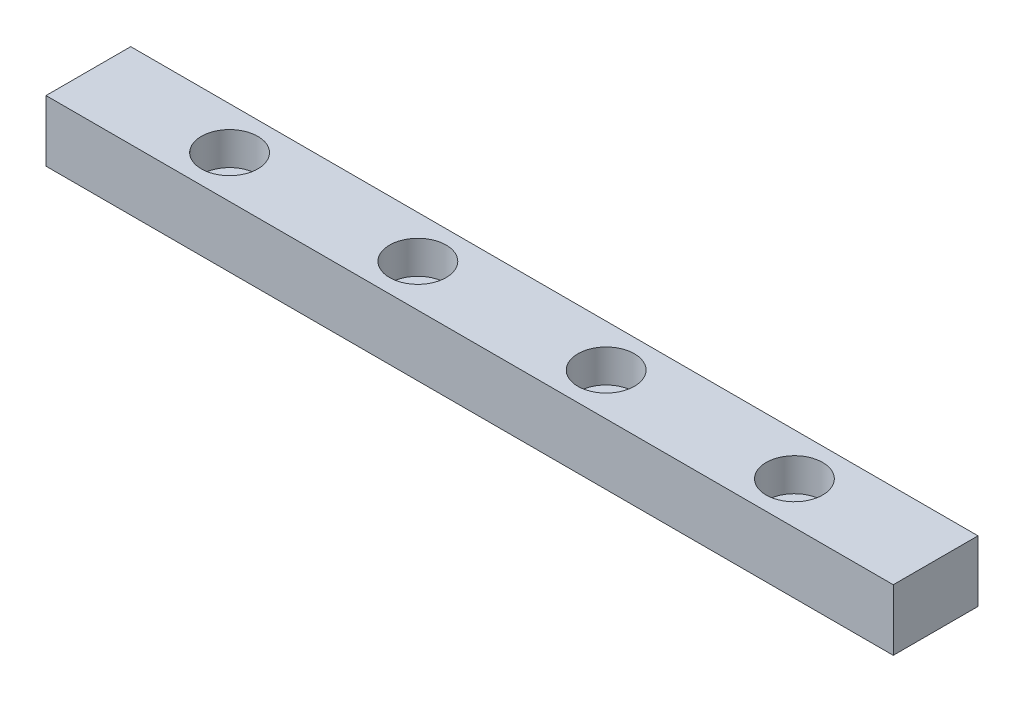
ISO-10303-21;
HEADER;
FILE_DESCRIPTION(('STEP AP214'),'2;1');
FILE_NAME('part.step','',(''),(''),'','','');
FILE_SCHEMA(('AUTOMOTIVE_DESIGN { 1 0 10303 214 1 1 1 1 }'));
ENDSEC;
DATA;
#1=APPLICATION_CONTEXT('core data for automotive mechanical design processes');
#2=APPLICATION_PROTOCOL_DEFINITION('international standard','automotive_design',2000,#1);
#3=PRODUCT_CONTEXT('',#1,'mechanical');
#4=PRODUCT('Part','Part','',(#3));
#5=PRODUCT_RELATED_PRODUCT_CATEGORY('part','',(#4));
#6=PRODUCT_DEFINITION_FORMATION('','',#4);
#7=PRODUCT_DEFINITION_CONTEXT('part definition',#1,'design');
#8=PRODUCT_DEFINITION('design','',#6,#7);
#9=PRODUCT_DEFINITION_SHAPE('','',#8);
#10=(LENGTH_UNIT() NAMED_UNIT(*) SI_UNIT(.MILLI.,.METRE.));
#11=(NAMED_UNIT(*) PLANE_ANGLE_UNIT() SI_UNIT($,.RADIAN.));
#12=(NAMED_UNIT(*) SI_UNIT($,.STERADIAN.) SOLID_ANGLE_UNIT());
#13=UNCERTAINTY_MEASURE_WITH_UNIT(LENGTH_MEASURE(1.E-05),#10,'distance_accuracy_value','');
#14=(GEOMETRIC_REPRESENTATION_CONTEXT(3) GLOBAL_UNCERTAINTY_ASSIGNED_CONTEXT((#13)) GLOBAL_UNIT_ASSIGNED_CONTEXT((#10,
#11,#12)) REPRESENTATION_CONTEXT('',''));
#15=CARTESIAN_POINT('',(0.,0.,0.));
#16=DIRECTION('',(0.,0.,1.));
#17=DIRECTION('',(1.,0.,0.));
#18=AXIS2_PLACEMENT_3D('',#15,#16,#17);
#19=CARTESIAN_POINT('',(90.,3.25,-4.5));
#20=DIRECTION('',(0.,0.,1.));
#21=DIRECTION('',(0.,-1.,0.));
#22=AXIS2_PLACEMENT_3D('',#19,#20,#21);
#23=PLANE('',#22);
#24=DIRECTION('',(0.,1.,0.));
#25=VECTOR('',#24,1.);
#26=CARTESIAN_POINT('',(0.,3.25,-4.5));
#27=LINE('',#26,#25);
#28=CARTESIAN_POINT('',(0.,-3.25,-4.5));
#29=VERTEX_POINT('',#28);
#30=CARTESIAN_POINT('',(0.,3.25,-4.5));
#31=VERTEX_POINT('',#30);
#32=EDGE_CURVE('E105',#29,#31,#27,.T.);
#33=ORIENTED_EDGE('',*,*,#32,.T.);
#34=DIRECTION('',(-1.,0.,0.));
#35=VECTOR('',#34,1.);
#36=CARTESIAN_POINT('',(90.,3.25,-4.5));
#37=LINE('',#36,#35);
#38=CARTESIAN_POINT('',(90.,3.25,-4.5));
#39=VERTEX_POINT('',#38);
#40=EDGE_CURVE('E11',#39,#31,#37,.T.);
#41=ORIENTED_EDGE('',*,*,#40,.F.);
#42=DIRECTION('',(0.,1.,0.));
#43=VECTOR('',#42,1.);
#44=CARTESIAN_POINT('',(90.,3.25,-4.5));
#45=LINE('',#44,#43);
#46=CARTESIAN_POINT('',(90.,-3.25,-4.5));
#47=VERTEX_POINT('',#46);
#48=EDGE_CURVE('E92',#47,#39,#45,.T.);
#49=ORIENTED_EDGE('',*,*,#48,.F.);
#50=DIRECTION('',(-1.,0.,0.));
#51=VECTOR('',#50,1.);
#52=CARTESIAN_POINT('',(90.,-3.25,-4.5));
#53=LINE('',#52,#51);
#54=EDGE_CURVE('E101',#47,#29,#53,.T.);
#55=ORIENTED_EDGE('',*,*,#54,.T.);
#56=EDGE_LOOP('',(#33,#41,#49,#55));
#57=FACE_BOUND('',#56,.T.);
#58=ADVANCED_FACE('F39',(#57),#23,.F.);
#59=CARTESIAN_POINT('',(90.,3.25,4.5));
#60=DIRECTION('',(0.,-1.,0.));
#61=DIRECTION('',(0.,0.,-1.));
#62=AXIS2_PLACEMENT_3D('',#59,#60,#61);
#63=PLANE('',#62);
#64=CARTESIAN_POINT('',(15.,3.25,0.));
#65=DIRECTION('',(0.,1.,0.));
#66=DIRECTION('',(0.,0.,1.));
#67=AXIS2_PLACEMENT_3D('',#64,#65,#66);
#68=CIRCLE('',#67,3.);
#69=CARTESIAN_POINT('',(15.,3.25,3.));
#70=VERTEX_POINT('',#69);
#71=EDGE_CURVE('E141',#70,#70,#68,.T.);
#72=ORIENTED_EDGE('',*,*,#71,.F.);
#73=EDGE_LOOP('',(#72));
#74=FACE_BOUND('',#73,.T.);
#75=CARTESIAN_POINT('',(75.,3.25,0.));
#76=DIRECTION('',(0.,1.,0.));
#77=DIRECTION('',(0.,0.,1.));
#78=AXIS2_PLACEMENT_3D('',#75,#76,#77);
#79=CIRCLE('',#78,3.00000000000001);
#80=CARTESIAN_POINT('',(75.,3.25,3.00000000000001));
#81=VERTEX_POINT('',#80);
#82=EDGE_CURVE('E125',#81,#81,#79,.T.);
#83=ORIENTED_EDGE('',*,*,#82,.F.);
#84=EDGE_LOOP('',(#83));
#85=FACE_BOUND('',#84,.T.);
#86=CARTESIAN_POINT('',(55.,3.25,0.));
#87=DIRECTION('',(0.,1.,0.));
#88=DIRECTION('',(0.,0.,1.));
#89=AXIS2_PLACEMENT_3D('',#86,#87,#88);
#90=CIRCLE('',#89,2.99999999999999);
#91=CARTESIAN_POINT('',(55.,3.25,2.99999999999999));
#92=VERTEX_POINT('',#91);
#93=EDGE_CURVE('E134',#92,#92,#90,.T.);
#94=ORIENTED_EDGE('',*,*,#93,.F.);
#95=EDGE_LOOP('',(#94));
#96=FACE_BOUND('',#95,.T.);
#97=CARTESIAN_POINT('',(35.,3.25,0.));
#98=DIRECTION('',(0.,1.,0.));
#99=DIRECTION('',(0.,0.,1.));
#100=AXIS2_PLACEMENT_3D('',#97,#98,#99);
#101=CIRCLE('',#100,3.);
#102=CARTESIAN_POINT('',(35.,3.25,3.));
#103=VERTEX_POINT('',#102);
#104=EDGE_CURVE('E142',#103,#103,#101,.T.);
#105=ORIENTED_EDGE('',*,*,#104,.F.);
#106=EDGE_LOOP('',(#105));
#107=FACE_BOUND('',#106,.T.);
#108=DIRECTION('',(0.,0.,1.));
#109=VECTOR('',#108,1.);
#110=CARTESIAN_POINT('',(0.,3.25,4.5));
#111=LINE('',#110,#109);
#112=CARTESIAN_POINT('',(0.,3.25,4.5));
#113=VERTEX_POINT('',#112);
#114=EDGE_CURVE('E96',#31,#113,#111,.T.);
#115=ORIENTED_EDGE('',*,*,#114,.T.);
#116=DIRECTION('',(-1.,0.,0.));
#117=VECTOR('',#116,1.);
#118=CARTESIAN_POINT('',(90.,3.25,4.5));
#119=LINE('',#118,#117);
#120=CARTESIAN_POINT('',(90.,3.25,4.5));
#121=VERTEX_POINT('',#120);
#122=EDGE_CURVE('E48',#121,#113,#119,.T.);
#123=ORIENTED_EDGE('',*,*,#122,.F.);
#124=DIRECTION('',(0.,0.,1.));
#125=VECTOR('',#124,1.);
#126=CARTESIAN_POINT('',(90.,3.25,4.5));
#127=LINE('',#126,#125);
#128=EDGE_CURVE('E87',#39,#121,#127,.T.);
#129=ORIENTED_EDGE('',*,*,#128,.F.);
#130=ORIENTED_EDGE('',*,*,#40,.T.);
#131=EDGE_LOOP('',(#115,#123,#129,#130));
#132=FACE_BOUND('',#131,.T.);
#133=ADVANCED_FACE('F95',(#74,#85,#96,#107,#132),#63,.F.);
#134=CARTESIAN_POINT('',(90.,3.25,4.5));
#135=DIRECTION('',(0.,0.,-1.));
#136=DIRECTION('',(-1.,0.,0.));
#137=AXIS2_PLACEMENT_3D('',#134,#135,#136);
#138=PLANE('',#137);
#139=DIRECTION('',(0.,-1.,0.));
#140=VECTOR('',#139,1.);
#141=CARTESIAN_POINT('',(0.,3.25,4.5));
#142=LINE('',#141,#140);
#143=CARTESIAN_POINT('',(0.,-3.25,4.5));
#144=VERTEX_POINT('',#143);
#145=EDGE_CURVE('E74',#113,#144,#142,.T.);
#146=ORIENTED_EDGE('',*,*,#145,.T.);
#147=DIRECTION('',(-1.,0.,0.));
#148=VECTOR('',#147,1.);
#149=CARTESIAN_POINT('',(90.,-3.25,4.5));
#150=LINE('',#149,#148);
#151=CARTESIAN_POINT('',(90.,-3.25,4.5));
#152=VERTEX_POINT('',#151);
#153=EDGE_CURVE('E97',#152,#144,#150,.T.);
#154=ORIENTED_EDGE('',*,*,#153,.F.);
#155=DIRECTION('',(0.,-1.,0.));
#156=VECTOR('',#155,1.);
#157=CARTESIAN_POINT('',(90.,3.25,4.5));
#158=LINE('',#157,#156);
#159=EDGE_CURVE('E90',#121,#152,#158,.T.);
#160=ORIENTED_EDGE('',*,*,#159,.F.);
#161=ORIENTED_EDGE('',*,*,#122,.T.);
#162=EDGE_LOOP('',(#146,#154,#160,#161));
#163=FACE_BOUND('',#162,.T.);
#164=ADVANCED_FACE('F99',(#163),#138,.F.);
#165=CARTESIAN_POINT('',(90.,-3.25,4.5));
#166=DIRECTION('',(0.,1.,0.));
#167=DIRECTION('',(0.,0.,1.));
#168=AXIS2_PLACEMENT_3D('',#165,#166,#167);
#169=PLANE('',#168);
#170=CARTESIAN_POINT('',(15.,-3.25,0.));
#171=DIRECTION('',(0.,1.,0.));
#172=DIRECTION('',(0.,0.,1.));
#173=AXIS2_PLACEMENT_3D('',#170,#171,#172);
#174=CIRCLE('',#173,1.75);
#175=CARTESIAN_POINT('',(15.,-3.25,1.75));
#176=VERTEX_POINT('',#175);
#177=EDGE_CURVE('E118',#176,#176,#174,.T.);
#178=ORIENTED_EDGE('',*,*,#177,.T.);
#179=EDGE_LOOP('',(#178));
#180=FACE_BOUND('',#179,.T.);
#181=CARTESIAN_POINT('',(75.,-3.25,0.));
#182=DIRECTION('',(0.,1.,0.));
#183=DIRECTION('',(0.,0.,1.));
#184=AXIS2_PLACEMENT_3D('',#181,#182,#183);
#185=CIRCLE('',#184,1.75);
#186=CARTESIAN_POINT('',(75.,-3.25,1.75));
#187=VERTEX_POINT('',#186);
#188=EDGE_CURVE('E161',#187,#187,#185,.T.);
#189=ORIENTED_EDGE('',*,*,#188,.T.);
#190=EDGE_LOOP('',(#189));
#191=FACE_BOUND('',#190,.T.);
#192=CARTESIAN_POINT('',(55.,-3.25,0.));
#193=DIRECTION('',(0.,1.,0.));
#194=DIRECTION('',(0.,0.,1.));
#195=AXIS2_PLACEMENT_3D('',#192,#193,#194);
#196=CIRCLE('',#195,1.75);
#197=CARTESIAN_POINT('',(55.,-3.25,1.75));
#198=VERTEX_POINT('',#197);
#199=EDGE_CURVE('E160',#198,#198,#196,.T.);
#200=ORIENTED_EDGE('',*,*,#199,.T.);
#201=EDGE_LOOP('',(#200));
#202=FACE_BOUND('',#201,.T.);
#203=CARTESIAN_POINT('',(35.,-3.25,0.));
#204=DIRECTION('',(0.,1.,0.));
#205=DIRECTION('',(0.,0.,1.));
#206=AXIS2_PLACEMENT_3D('',#203,#204,#205);
#207=CIRCLE('',#206,1.75);
#208=CARTESIAN_POINT('',(35.,-3.25,1.75));
#209=VERTEX_POINT('',#208);
#210=EDGE_CURVE('E157',#209,#209,#207,.T.);
#211=ORIENTED_EDGE('',*,*,#210,.T.);
#212=EDGE_LOOP('',(#211));
#213=FACE_BOUND('',#212,.T.);
#214=DIRECTION('',(0.,0.,-1.));
#215=VECTOR('',#214,1.);
#216=CARTESIAN_POINT('',(0.,-3.25,4.5));
#217=LINE('',#216,#215);
#218=EDGE_CURVE('E80',#144,#29,#217,.T.);
#219=ORIENTED_EDGE('',*,*,#218,.T.);
#220=ORIENTED_EDGE('',*,*,#54,.F.);
#221=DIRECTION('',(0.,0.,-1.));
#222=VECTOR('',#221,1.);
#223=CARTESIAN_POINT('',(90.,-3.25,4.5));
#224=LINE('',#223,#222);
#225=EDGE_CURVE('E57',#152,#47,#224,.T.);
#226=ORIENTED_EDGE('',*,*,#225,.F.);
#227=ORIENTED_EDGE('',*,*,#153,.T.);
#228=EDGE_LOOP('',(#219,#220,#226,#227));
#229=FACE_BOUND('',#228,.T.);
#230=ADVANCED_FACE('F169',(#180,#191,#202,#213,#229),#169,.F.);
#231=CARTESIAN_POINT('',(90.,0.,0.));
#232=DIRECTION('',(1.,0.,0.));
#233=DIRECTION('',(0.,0.,-1.));
#234=AXIS2_PLACEMENT_3D('',#231,#232,#233);
#235=PLANE('',#234);
#236=ORIENTED_EDGE('',*,*,#48,.T.);
#237=ORIENTED_EDGE('',*,*,#128,.T.);
#238=ORIENTED_EDGE('',*,*,#159,.T.);
#239=ORIENTED_EDGE('',*,*,#225,.T.);
#240=EDGE_LOOP('',(#236,#237,#238,#239));
#241=FACE_BOUND('',#240,.T.);
#242=ADVANCED_FACE('F88',(#241),#235,.T.);
#243=CARTESIAN_POINT('',(0.,0.,0.));
#244=DIRECTION('',(1.,0.,0.));
#245=DIRECTION('',(0.,0.,-1.));
#246=AXIS2_PLACEMENT_3D('',#243,#244,#245);
#247=PLANE('',#246);
#248=ORIENTED_EDGE('',*,*,#32,.F.);
#249=ORIENTED_EDGE('',*,*,#218,.F.);
#250=ORIENTED_EDGE('',*,*,#145,.F.);
#251=ORIENTED_EDGE('',*,*,#114,.F.);
#252=EDGE_LOOP('',(#248,#249,#250,#251));
#253=FACE_BOUND('',#252,.T.);
#254=ADVANCED_FACE('F198',(#253),#247,.F.);
#255=CARTESIAN_POINT('',(35.,-0.250000000000002,0.));
#256=DIRECTION('',(0.,1.,0.));
#257=DIRECTION('',(0.,0.,1.));
#258=AXIS2_PLACEMENT_3D('',#255,#256,#257);
#259=CYLINDRICAL_SURFACE('',#258,3.);
#260=CARTESIAN_POINT('',(35.,-0.250000000000002,0.));
#261=DIRECTION('',(0.,1.,0.));
#262=DIRECTION('',(0.,0.,1.));
#263=AXIS2_PLACEMENT_3D('',#260,#261,#262);
#264=CIRCLE('',#263,3.);
#265=CARTESIAN_POINT('',(35.,-0.250000000000002,3.));
#266=VERTEX_POINT('',#265);
#267=EDGE_CURVE('E138',#266,#266,#264,.T.);
#268=ORIENTED_EDGE('',*,*,#267,.F.);
#269=EDGE_LOOP('',(#268));
#270=FACE_BOUND('',#269,.T.);
#271=ORIENTED_EDGE('',*,*,#104,.T.);
#272=EDGE_LOOP('',(#271));
#273=FACE_BOUND('',#272,.T.);
#274=ADVANCED_FACE('F200',(#270,#273),#259,.F.);
#275=CARTESIAN_POINT('',(35.,-0.250000000000002,0.));
#276=DIRECTION('',(0.,1.,0.));
#277=DIRECTION('',(0.,0.,1.));
#278=AXIS2_PLACEMENT_3D('',#275,#276,#277);
#279=PLANE('',#278);
#280=CARTESIAN_POINT('',(35.,-0.250000000000002,0.));
#281=DIRECTION('',(0.,1.,0.));
#282=DIRECTION('',(0.,0.,1.));
#283=AXIS2_PLACEMENT_3D('',#280,#281,#282);
#284=CIRCLE('',#283,1.75);
#285=CARTESIAN_POINT('',(35.,-0.250000000000002,1.75));
#286=VERTEX_POINT('',#285);
#287=EDGE_CURVE('E42',#286,#286,#284,.T.);
#288=ORIENTED_EDGE('',*,*,#287,.F.);
#289=EDGE_LOOP('',(#288));
#290=FACE_BOUND('',#289,.T.);
#291=ORIENTED_EDGE('',*,*,#267,.T.);
#292=EDGE_LOOP('',(#291));
#293=FACE_BOUND('',#292,.T.);
#294=ADVANCED_FACE('F206',(#290,#293),#279,.T.);
#295=CARTESIAN_POINT('',(55.,-0.250000000000002,0.));
#296=DIRECTION('',(0.,1.,0.));
#297=DIRECTION('',(0.,0.,1.));
#298=AXIS2_PLACEMENT_3D('',#295,#296,#297);
#299=CYLINDRICAL_SURFACE('',#298,2.99999999999999);
#300=CARTESIAN_POINT('',(55.,-0.250000000000002,0.));
#301=DIRECTION('',(0.,1.,0.));
#302=DIRECTION('',(0.,0.,1.));
#303=AXIS2_PLACEMENT_3D('',#300,#301,#302);
#304=CIRCLE('',#303,2.99999999999999);
#305=CARTESIAN_POINT('',(55.,-0.250000000000002,2.99999999999999));
#306=VERTEX_POINT('',#305);
#307=EDGE_CURVE('E144',#306,#306,#304,.T.);
#308=ORIENTED_EDGE('',*,*,#307,.F.);
#309=EDGE_LOOP('',(#308));
#310=FACE_BOUND('',#309,.T.);
#311=ORIENTED_EDGE('',*,*,#93,.T.);
#312=EDGE_LOOP('',(#311));
#313=FACE_BOUND('',#312,.T.);
#314=ADVANCED_FACE('F237',(#310,#313),#299,.F.);
#315=CARTESIAN_POINT('',(55.,-0.250000000000002,0.));
#316=DIRECTION('',(0.,1.,0.));
#317=DIRECTION('',(0.,0.,1.));
#318=AXIS2_PLACEMENT_3D('',#315,#316,#317);
#319=PLANE('',#318);
#320=CARTESIAN_POINT('',(55.,-0.250000000000002,0.));
#321=DIRECTION('',(0.,1.,0.));
#322=DIRECTION('',(0.,0.,1.));
#323=AXIS2_PLACEMENT_3D('',#320,#321,#322);
#324=CIRCLE('',#323,1.75);
#325=CARTESIAN_POINT('',(55.,-0.250000000000002,1.75));
#326=VERTEX_POINT('',#325);
#327=EDGE_CURVE('E120',#326,#326,#324,.T.);
#328=ORIENTED_EDGE('',*,*,#327,.F.);
#329=EDGE_LOOP('',(#328));
#330=FACE_BOUND('',#329,.T.);
#331=ORIENTED_EDGE('',*,*,#307,.T.);
#332=EDGE_LOOP('',(#331));
#333=FACE_BOUND('',#332,.T.);
#334=ADVANCED_FACE('F245',(#330,#333),#319,.T.);
#335=CARTESIAN_POINT('',(75.,-0.250000000000002,0.));
#336=DIRECTION('',(0.,1.,0.));
#337=DIRECTION('',(0.,0.,1.));
#338=AXIS2_PLACEMENT_3D('',#335,#336,#337);
#339=CYLINDRICAL_SURFACE('',#338,3.00000000000001);
#340=CARTESIAN_POINT('',(75.,-0.250000000000002,0.));
#341=DIRECTION('',(0.,1.,0.));
#342=DIRECTION('',(0.,0.,1.));
#343=AXIS2_PLACEMENT_3D('',#340,#341,#342);
#344=CIRCLE('',#343,3.00000000000001);
#345=CARTESIAN_POINT('',(75.,-0.250000000000002,3.00000000000001));
#346=VERTEX_POINT('',#345);
#347=EDGE_CURVE('E129',#346,#346,#344,.T.);
#348=ORIENTED_EDGE('',*,*,#347,.F.);
#349=EDGE_LOOP('',(#348));
#350=FACE_BOUND('',#349,.T.);
#351=ORIENTED_EDGE('',*,*,#82,.T.);
#352=EDGE_LOOP('',(#351));
#353=FACE_BOUND('',#352,.T.);
#354=ADVANCED_FACE('F253',(#350,#353),#339,.F.);
#355=CARTESIAN_POINT('',(75.,-0.250000000000002,0.));
#356=DIRECTION('',(0.,1.,0.));
#357=DIRECTION('',(0.,0.,1.));
#358=AXIS2_PLACEMENT_3D('',#355,#356,#357);
#359=PLANE('',#358);
#360=CARTESIAN_POINT('',(75.,-0.250000000000002,0.));
#361=DIRECTION('',(0.,1.,0.));
#362=DIRECTION('',(0.,0.,1.));
#363=AXIS2_PLACEMENT_3D('',#360,#361,#362);
#364=CIRCLE('',#363,1.75);
#365=CARTESIAN_POINT('',(75.,-0.250000000000002,1.75));
#366=VERTEX_POINT('',#365);
#367=EDGE_CURVE('E117',#366,#366,#364,.T.);
#368=ORIENTED_EDGE('',*,*,#367,.F.);
#369=EDGE_LOOP('',(#368));
#370=FACE_BOUND('',#369,.T.);
#371=ORIENTED_EDGE('',*,*,#347,.T.);
#372=EDGE_LOOP('',(#371));
#373=FACE_BOUND('',#372,.T.);
#374=ADVANCED_FACE('F261',(#370,#373),#359,.T.);
#375=CARTESIAN_POINT('',(15.,-0.250000000000002,0.));
#376=DIRECTION('',(0.,1.,0.));
#377=DIRECTION('',(0.,0.,1.));
#378=AXIS2_PLACEMENT_3D('',#375,#376,#377);
#379=CYLINDRICAL_SURFACE('',#378,3.);
#380=CARTESIAN_POINT('',(15.,-0.250000000000002,0.));
#381=DIRECTION('',(0.,1.,0.));
#382=DIRECTION('',(0.,0.,1.));
#383=AXIS2_PLACEMENT_3D('',#380,#381,#382);
#384=CIRCLE('',#383,3.);
#385=CARTESIAN_POINT('',(15.,-0.250000000000002,3.));
#386=VERTEX_POINT('',#385);
#387=EDGE_CURVE('E108',#386,#386,#384,.T.);
#388=ORIENTED_EDGE('',*,*,#387,.F.);
#389=EDGE_LOOP('',(#388));
#390=FACE_BOUND('',#389,.T.);
#391=ORIENTED_EDGE('',*,*,#71,.T.);
#392=EDGE_LOOP('',(#391));
#393=FACE_BOUND('',#392,.T.);
#394=ADVANCED_FACE('F185',(#390,#393),#379,.F.);
#395=CARTESIAN_POINT('',(15.,-0.250000000000002,0.));
#396=DIRECTION('',(0.,1.,0.));
#397=DIRECTION('',(0.,0.,1.));
#398=AXIS2_PLACEMENT_3D('',#395,#396,#397);
#399=PLANE('',#398);
#400=CARTESIAN_POINT('',(15.,-0.250000000000002,0.));
#401=DIRECTION('',(0.,1.,0.));
#402=DIRECTION('',(0.,0.,1.));
#403=AXIS2_PLACEMENT_3D('',#400,#401,#402);
#404=CIRCLE('',#403,1.75);
#405=CARTESIAN_POINT('',(15.,-0.250000000000002,1.75));
#406=VERTEX_POINT('',#405);
#407=EDGE_CURVE('E114',#406,#406,#404,.T.);
#408=ORIENTED_EDGE('',*,*,#407,.F.);
#409=EDGE_LOOP('',(#408));
#410=FACE_BOUND('',#409,.T.);
#411=ORIENTED_EDGE('',*,*,#387,.T.);
#412=EDGE_LOOP('',(#411));
#413=FACE_BOUND('',#412,.T.);
#414=ADVANCED_FACE('F175',(#410,#413),#399,.T.);
#415=CARTESIAN_POINT('',(15.,-3.25,0.));
#416=DIRECTION('',(0.,1.,0.));
#417=DIRECTION('',(0.,0.,1.));
#418=AXIS2_PLACEMENT_3D('',#415,#416,#417);
#419=CYLINDRICAL_SURFACE('',#418,1.75);
#420=ORIENTED_EDGE('',*,*,#407,.T.);
#421=EDGE_LOOP('',(#420));
#422=FACE_BOUND('',#421,.T.);
#423=ORIENTED_EDGE('',*,*,#177,.F.);
#424=EDGE_LOOP('',(#423));
#425=FACE_BOUND('',#424,.T.);
#426=ADVANCED_FACE('F172',(#422,#425),#419,.F.);
#427=CARTESIAN_POINT('',(75.,-3.25,0.));
#428=DIRECTION('',(0.,1.,0.));
#429=DIRECTION('',(0.,0.,1.));
#430=AXIS2_PLACEMENT_3D('',#427,#428,#429);
#431=CYLINDRICAL_SURFACE('',#430,1.75);
#432=ORIENTED_EDGE('',*,*,#367,.T.);
#433=EDGE_LOOP('',(#432));
#434=FACE_BOUND('',#433,.T.);
#435=ORIENTED_EDGE('',*,*,#188,.F.);
#436=EDGE_LOOP('',(#435));
#437=FACE_BOUND('',#436,.T.);
#438=ADVANCED_FACE('F174',(#434,#437),#431,.F.);
#439=CARTESIAN_POINT('',(55.,-3.25,0.));
#440=DIRECTION('',(0.,1.,0.));
#441=DIRECTION('',(0.,0.,1.));
#442=AXIS2_PLACEMENT_3D('',#439,#440,#441);
#443=CYLINDRICAL_SURFACE('',#442,1.75);
#444=ORIENTED_EDGE('',*,*,#327,.T.);
#445=EDGE_LOOP('',(#444));
#446=FACE_BOUND('',#445,.T.);
#447=ORIENTED_EDGE('',*,*,#199,.F.);
#448=EDGE_LOOP('',(#447));
#449=FACE_BOUND('',#448,.T.);
#450=ADVANCED_FACE('F182',(#446,#449),#443,.F.);
#451=CARTESIAN_POINT('',(35.,-3.25,0.));
#452=DIRECTION('',(0.,1.,0.));
#453=DIRECTION('',(0.,0.,1.));
#454=AXIS2_PLACEMENT_3D('',#451,#452,#453);
#455=CYLINDRICAL_SURFACE('',#454,1.75);
#456=ORIENTED_EDGE('',*,*,#287,.T.);
#457=EDGE_LOOP('',(#456));
#458=FACE_BOUND('',#457,.T.);
#459=ORIENTED_EDGE('',*,*,#210,.F.);
#460=EDGE_LOOP('',(#459));
#461=FACE_BOUND('',#460,.T.);
#462=ADVANCED_FACE('F292',(#458,#461),#455,.F.);
#463=CLOSED_SHELL('',(#58,#133,#164,#230,#242,#254,#274,#294,#314,#334,#354,#374,#394,#414,#426,
#438,#450,#462));
#464=MANIFOLD_SOLID_BREP('B2',#463);
#465=ADVANCED_BREP_SHAPE_REPRESENTATION('',(#18,#464),#14);
#466=SHAPE_DEFINITION_REPRESENTATION(#9,#465);
ENDSEC;
END-ISO-10303-21;
